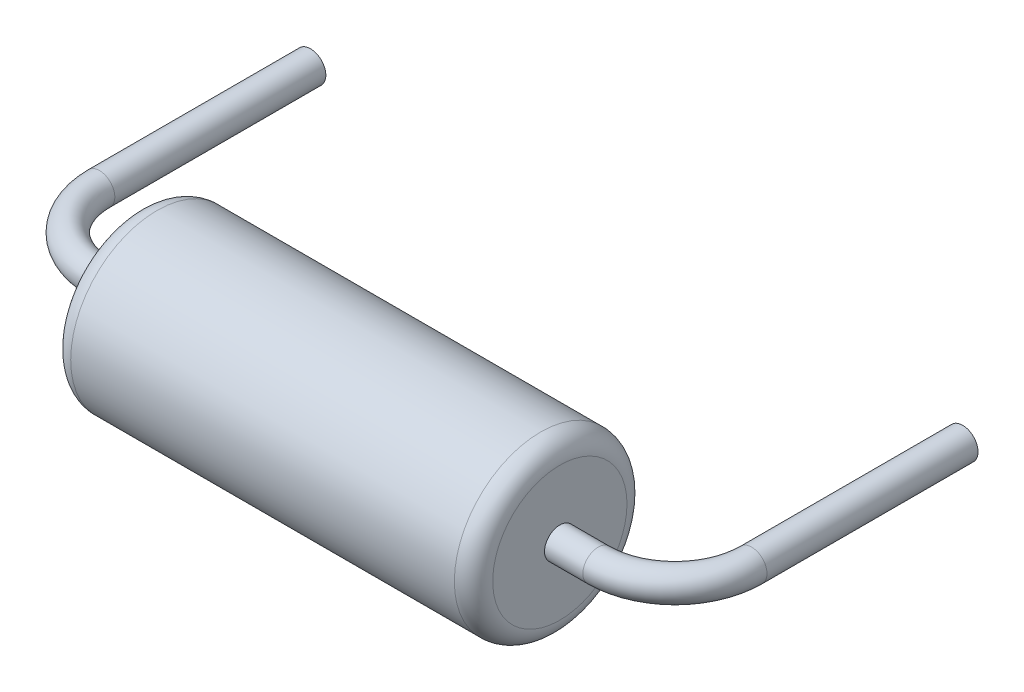
ISO-10303-21;
HEADER;
FILE_DESCRIPTION(('STEP AP214'),'2;1');
FILE_NAME('part.step','',(''),(''),'','','');
FILE_SCHEMA(('AUTOMOTIVE_DESIGN { 1 0 10303 214 1 1 1 1 }'));
ENDSEC;
DATA;
#1=APPLICATION_CONTEXT('core data for automotive mechanical design processes');
#2=APPLICATION_PROTOCOL_DEFINITION('international standard','automotive_design',2000,#1);
#3=PRODUCT_CONTEXT('',#1,'mechanical');
#4=PRODUCT('Part','Part','',(#3));
#5=PRODUCT_RELATED_PRODUCT_CATEGORY('part','',(#4));
#6=PRODUCT_DEFINITION_FORMATION('','',#4);
#7=PRODUCT_DEFINITION_CONTEXT('part definition',#1,'design');
#8=PRODUCT_DEFINITION('design','',#6,#7);
#9=PRODUCT_DEFINITION_SHAPE('','',#8);
#10=(LENGTH_UNIT() NAMED_UNIT(*) SI_UNIT(.MILLI.,.METRE.));
#11=(NAMED_UNIT(*) PLANE_ANGLE_UNIT() SI_UNIT($,.RADIAN.));
#12=(NAMED_UNIT(*) SI_UNIT($,.STERADIAN.) SOLID_ANGLE_UNIT());
#13=UNCERTAINTY_MEASURE_WITH_UNIT(LENGTH_MEASURE(1.E-05),#10,'distance_accuracy_value','');
#14=(GEOMETRIC_REPRESENTATION_CONTEXT(3) GLOBAL_UNCERTAINTY_ASSIGNED_CONTEXT((#13)) GLOBAL_UNIT_ASSIGNED_CONTEXT((#10,
#11,#12)) REPRESENTATION_CONTEXT('',''));
#15=CARTESIAN_POINT('',(0.,0.,0.));
#16=DIRECTION('',(0.,0.,1.));
#17=DIRECTION('',(1.,0.,0.));
#18=AXIS2_PLACEMENT_3D('',#15,#16,#17);
#19=CARTESIAN_POINT('',(14.,0.,2.25));
#20=DIRECTION('',(-1.,0.,0.));
#21=DIRECTION('',(0.,0.,1.));
#22=AXIS2_PLACEMENT_3D('',#19,#20,#21);
#23=CYLINDRICAL_SURFACE('',#22,2.25);
#24=CARTESIAN_POINT('',(3.5,0.,2.25));
#25=DIRECTION('',(1.,0.,0.));
#26=DIRECTION('',(0.,0.,-1.));
#27=AXIS2_PLACEMENT_3D('',#24,#25,#26);
#28=CIRCLE('',#27,2.25);
#29=CARTESIAN_POINT('',(3.5,0.,0.));
#30=VERTEX_POINT('',#29);
#31=EDGE_CURVE('E39',#30,#30,#28,.T.);
#32=ORIENTED_EDGE('',*,*,#31,.T.);
#33=EDGE_LOOP('',(#32));
#34=FACE_BOUND('',#33,.T.);
#35=CARTESIAN_POINT('',(13.5,0.,2.25));
#36=DIRECTION('',(1.,0.,0.));
#37=DIRECTION('',(0.,0.,-1.));
#38=AXIS2_PLACEMENT_3D('',#35,#36,#37);
#39=CIRCLE('',#38,2.25);
#40=CARTESIAN_POINT('',(13.5,0.,0.));
#41=VERTEX_POINT('',#40);
#42=EDGE_CURVE('E43',#41,#41,#39,.F.);
#43=ORIENTED_EDGE('',*,*,#42,.T.);
#44=EDGE_LOOP('',(#43));
#45=FACE_BOUND('',#44,.T.);
#46=ADVANCED_FACE('F29',(#34,#45),#23,.T.);
#47=CARTESIAN_POINT('',(14.,0.,2.25));
#48=DIRECTION('',(1.,0.,0.));
#49=DIRECTION('',(0.,0.,-1.));
#50=AXIS2_PLACEMENT_3D('',#47,#48,#49);
#51=PLANE('',#50);
#52=CARTESIAN_POINT('',(14.,0.,2.25));
#53=DIRECTION('',(1.,0.,0.));
#54=DIRECTION('',(0.,0.,-1.));
#55=AXIS2_PLACEMENT_3D('',#52,#53,#54);
#56=CIRCLE('',#55,1.75);
#57=CARTESIAN_POINT('',(14.,0.,0.5));
#58=VERTEX_POINT('',#57);
#59=EDGE_CURVE('E10',#58,#58,#56,.T.);
#60=ORIENTED_EDGE('',*,*,#59,.T.);
#61=EDGE_LOOP('',(#60));
#62=FACE_BOUND('',#61,.T.);
#63=CARTESIAN_POINT('',(14.,0.,2.25));
#64=DIRECTION('',(1.,0.,0.));
#65=DIRECTION('',(0.,0.,-1.));
#66=AXIS2_PLACEMENT_3D('',#63,#64,#65);
#67=CIRCLE('',#66,0.4);
#68=CARTESIAN_POINT('',(14.,0.,1.85));
#69=VERTEX_POINT('',#68);
#70=EDGE_CURVE('E48',#69,#69,#67,.T.);
#71=ORIENTED_EDGE('',*,*,#70,.F.);
#72=EDGE_LOOP('',(#71));
#73=FACE_BOUND('',#72,.T.);
#74=ADVANCED_FACE('F91',(#62,#73),#51,.T.);
#75=CARTESIAN_POINT('',(3.,0.,2.25));
#76=DIRECTION('',(1.,0.,0.));
#77=DIRECTION('',(0.,0.,-1.));
#78=AXIS2_PLACEMENT_3D('',#75,#76,#77);
#79=PLANE('',#78);
#80=CARTESIAN_POINT('',(3.,0.,2.25));
#81=DIRECTION('',(1.,0.,0.));
#82=DIRECTION('',(0.,0.,-1.));
#83=AXIS2_PLACEMENT_3D('',#80,#81,#82);
#84=CIRCLE('',#83,1.75);
#85=CARTESIAN_POINT('',(3.,0.,0.5));
#86=VERTEX_POINT('',#85);
#87=EDGE_CURVE('E35',#86,#86,#84,.F.);
#88=ORIENTED_EDGE('',*,*,#87,.T.);
#89=EDGE_LOOP('',(#88));
#90=FACE_BOUND('',#89,.T.);
#91=CARTESIAN_POINT('',(3.,0.,2.25));
#92=DIRECTION('',(1.,0.,0.));
#93=DIRECTION('',(0.,0.,-1.));
#94=AXIS2_PLACEMENT_3D('',#91,#92,#93);
#95=CIRCLE('',#94,0.4);
#96=CARTESIAN_POINT('',(3.,0.,1.85));
#97=VERTEX_POINT('',#96);
#98=EDGE_CURVE('E51',#97,#97,#95,.T.);
#99=ORIENTED_EDGE('',*,*,#98,.T.);
#100=EDGE_LOOP('',(#99));
#101=FACE_BOUND('',#100,.T.);
#102=ADVANCED_FACE('F96',(#90,#101),#79,.F.);
#103=CARTESIAN_POINT('',(17.,0.,-5.2500032705152));
#104=DIRECTION('',(0.,0.,-1.));
#105=DIRECTION('',(-1.,0.,0.));
#106=AXIS2_PLACEMENT_3D('',#103,#104,#105);
#107=PLANE('',#106);
#108=CARTESIAN_POINT('',(17.,0.,-5.2500032705152));
#109=DIRECTION('',(0.,0.,-1.));
#110=DIRECTION('',(-1.,0.,0.));
#111=AXIS2_PLACEMENT_3D('',#108,#109,#110);
#112=CIRCLE('',#111,0.4);
#113=CARTESIAN_POINT('',(16.6,0.,-5.2500032705152));
#114=VERTEX_POINT('',#113);
#115=EDGE_CURVE('E54',#114,#114,#112,.T.);
#116=ORIENTED_EDGE('',*,*,#115,.T.);
#117=EDGE_LOOP('',(#116));
#118=FACE_BOUND('',#117,.T.);
#119=ADVANCED_FACE('F120',(#118),#107,.T.);
#120=CARTESIAN_POINT('',(17.,0.,0.249999999999986));
#121=DIRECTION('',(0.,0.,-1.));
#122=DIRECTION('',(-1.,0.,0.));
#123=AXIS2_PLACEMENT_3D('',#120,#121,#122);
#124=CYLINDRICAL_SURFACE('',#123,0.4);
#125=CARTESIAN_POINT('',(17.,0.,0.249999999999986));
#126=DIRECTION('',(0.,0.,-1.));
#127=DIRECTION('',(-1.,0.,0.));
#128=AXIS2_PLACEMENT_3D('',#125,#126,#127);
#129=CIRCLE('',#128,0.4);
#130=CARTESIAN_POINT('',(17.4,0.,0.249999999999984));
#131=VERTEX_POINT('',#130);
#132=EDGE_CURVE('E57',#131,#131,#129,.T.);
#133=ORIENTED_EDGE('',*,*,#132,.T.);
#134=EDGE_LOOP('',(#133));
#135=FACE_BOUND('',#134,.T.);
#136=ORIENTED_EDGE('',*,*,#115,.F.);
#137=EDGE_LOOP('',(#136));
#138=FACE_BOUND('',#137,.T.);
#139=ADVANCED_FACE('F182',(#135,#138),#124,.T.);
#140=CARTESIAN_POINT('',(15.,0.,0.25));
#141=DIRECTION('',(0.,1.,0.));
#142=DIRECTION('',(0.,0.,1.));
#143=AXIS2_PLACEMENT_3D('',#140,#141,#142);
#144=TOROIDAL_SURFACE('',#143,2.,0.4);
#145=CARTESIAN_POINT('',(15.,0.,2.25));
#146=DIRECTION('',(1.,0.,0.));
#147=DIRECTION('',(0.,0.,-1.));
#148=AXIS2_PLACEMENT_3D('',#145,#146,#147);
#149=CIRCLE('',#148,0.4);
#150=CARTESIAN_POINT('',(15.,0.,2.65));
#151=VERTEX_POINT('',#150);
#152=EDGE_CURVE('E60',#151,#151,#149,.T.);
#153=CARTESIAN_POINT('',(15.,0.,0.25));
#154=DIRECTION('',(0.,1.,0.));
#155=DIRECTION('',(0.,0.,1.));
#156=AXIS2_PLACEMENT_3D('',#153,#154,#155);
#157=CIRCLE('',#156,2.4);
#158=EDGE_CURVE('',#151,#131,#157,.T.);
#159=ORIENTED_EDGE('',*,*,#152,.T.);
#160=ORIENTED_EDGE('',*,*,#132,.F.);
#161=ORIENTED_EDGE('',*,*,#158,.T.);
#162=ORIENTED_EDGE('',*,*,#158,.F.);
#163=EDGE_LOOP('',(#159,#161,#160,#162));
#164=FACE_BOUND('',#163,.T.);
#165=ADVANCED_FACE('F171',(#164),#144,.T.);
#166=CARTESIAN_POINT('',(2.,0.,2.25));
#167=DIRECTION('',(1.,0.,0.));
#168=DIRECTION('',(0.,0.,-1.));
#169=AXIS2_PLACEMENT_3D('',#166,#167,#168);
#170=CYLINDRICAL_SURFACE('',#169,0.4);
#171=ORIENTED_EDGE('',*,*,#70,.T.);
#172=EDGE_LOOP('',(#171));
#173=FACE_BOUND('',#172,.T.);
#174=ORIENTED_EDGE('',*,*,#152,.F.);
#175=EDGE_LOOP('',(#174));
#176=FACE_BOUND('',#175,.T.);
#177=ADVANCED_FACE('F160',(#173,#176),#170,.T.);
#178=CARTESIAN_POINT('',(2.,0.,2.25));
#179=DIRECTION('',(1.,0.,0.));
#180=DIRECTION('',(0.,0.,-1.));
#181=AXIS2_PLACEMENT_3D('',#178,#179,#180);
#182=CIRCLE('',#181,0.4);
#183=CARTESIAN_POINT('',(2.,0.,2.65));
#184=VERTEX_POINT('',#183);
#185=EDGE_CURVE('E63',#184,#184,#182,.T.);
#186=ORIENTED_EDGE('',*,*,#185,.T.);
#187=EDGE_LOOP('',(#186));
#188=FACE_BOUND('',#187,.T.);
#189=ORIENTED_EDGE('',*,*,#98,.F.);
#190=EDGE_LOOP('',(#189));
#191=FACE_BOUND('',#190,.T.);
#192=ADVANCED_FACE('F150',(#188,#191),#170,.T.);
#193=CARTESIAN_POINT('',(2.,0.,0.25));
#194=DIRECTION('',(0.,1.,0.));
#195=DIRECTION('',(0.,0.,1.));
#196=AXIS2_PLACEMENT_3D('',#193,#194,#195);
#197=TOROIDAL_SURFACE('',#196,2.,0.4);
#198=CARTESIAN_POINT('',(0.,0.,0.25));
#199=DIRECTION('',(0.,0.,1.));
#200=DIRECTION('',(1.,0.,0.));
#201=AXIS2_PLACEMENT_3D('',#198,#199,#200);
#202=CIRCLE('',#201,0.4);
#203=CARTESIAN_POINT('',(-0.399999999999999,0.,0.25));
#204=VERTEX_POINT('',#203);
#205=EDGE_CURVE('E66',#204,#204,#202,.T.);
#206=CARTESIAN_POINT('',(2.,0.,0.25));
#207=DIRECTION('',(0.,1.,0.));
#208=DIRECTION('',(0.,0.,1.));
#209=AXIS2_PLACEMENT_3D('',#206,#207,#208);
#210=CIRCLE('',#209,2.4);
#211=EDGE_CURVE('',#204,#184,#210,.T.);
#212=ORIENTED_EDGE('',*,*,#205,.T.);
#213=ORIENTED_EDGE('',*,*,#185,.F.);
#214=ORIENTED_EDGE('',*,*,#211,.T.);
#215=ORIENTED_EDGE('',*,*,#211,.F.);
#216=EDGE_LOOP('',(#212,#214,#213,#215));
#217=FACE_BOUND('',#216,.T.);
#218=ADVANCED_FACE('F86',(#217),#197,.T.);
#219=CARTESIAN_POINT('',(0.,0.,0.25));
#220=DIRECTION('',(0.,0.,-1.));
#221=DIRECTION('',(-1.,0.,0.));
#222=AXIS2_PLACEMENT_3D('',#219,#220,#221);
#223=CYLINDRICAL_SURFACE('',#222,0.4);
#224=ORIENTED_EDGE('',*,*,#205,.F.);
#225=EDGE_LOOP('',(#224));
#226=FACE_BOUND('',#225,.T.);
#227=CARTESIAN_POINT('',(0.,0.,-5.25));
#228=DIRECTION('',(0.,0.,1.));
#229=DIRECTION('',(1.,0.,0.));
#230=AXIS2_PLACEMENT_3D('',#227,#228,#229);
#231=CIRCLE('',#230,0.4);
#232=CARTESIAN_POINT('',(0.4,0.,-5.25));
#233=VERTEX_POINT('',#232);
#234=EDGE_CURVE('E69',#233,#233,#231,.T.);
#235=ORIENTED_EDGE('',*,*,#234,.T.);
#236=EDGE_LOOP('',(#235));
#237=FACE_BOUND('',#236,.T.);
#238=ADVANCED_FACE('F73',(#226,#237),#223,.T.);
#239=CARTESIAN_POINT('',(0.,0.,-5.25));
#240=DIRECTION('',(0.,0.,1.));
#241=DIRECTION('',(1.,0.,0.));
#242=AXIS2_PLACEMENT_3D('',#239,#240,#241);
#243=PLANE('',#242);
#244=ORIENTED_EDGE('',*,*,#234,.F.);
#245=EDGE_LOOP('',(#244));
#246=FACE_BOUND('',#245,.T.);
#247=ADVANCED_FACE('F75',(#246),#243,.F.);
#248=CARTESIAN_POINT('',(3.5,0.,2.25));
#249=DIRECTION('',(1.,0.,0.));
#250=DIRECTION('',(0.,0.,-1.));
#251=AXIS2_PLACEMENT_3D('',#248,#249,#250);
#252=TOROIDAL_SURFACE('',#251,1.75,0.5);
#253=ORIENTED_EDGE('',*,*,#87,.F.);
#254=EDGE_LOOP('',(#253));
#255=FACE_BOUND('',#254,.T.);
#256=ORIENTED_EDGE('',*,*,#31,.F.);
#257=EDGE_LOOP('',(#256));
#258=FACE_BOUND('',#257,.T.);
#259=ADVANCED_FACE('F77',(#255,#258),#252,.T.);
#260=CARTESIAN_POINT('',(13.5,0.,2.25));
#261=DIRECTION('',(1.,0.,0.));
#262=DIRECTION('',(0.,0.,-1.));
#263=AXIS2_PLACEMENT_3D('',#260,#261,#262);
#264=TOROIDAL_SURFACE('',#263,1.75,0.5);
#265=ORIENTED_EDGE('',*,*,#42,.F.);
#266=EDGE_LOOP('',(#265));
#267=FACE_BOUND('',#266,.T.);
#268=ORIENTED_EDGE('',*,*,#59,.F.);
#269=EDGE_LOOP('',(#268));
#270=FACE_BOUND('',#269,.T.);
#271=ADVANCED_FACE('F83',(#267,#270),#264,.T.);
#272=CLOSED_SHELL('',(#46,#74,#102,#119,#139,#165,#177,#192,#218,#238,#247,#259,#271));
#273=MANIFOLD_SOLID_BREP('B2',#272);
#274=ADVANCED_BREP_SHAPE_REPRESENTATION('',(#18,#273),#14);
#275=SHAPE_DEFINITION_REPRESENTATION(#9,#274);
ENDSEC;
END-ISO-10303-21;
